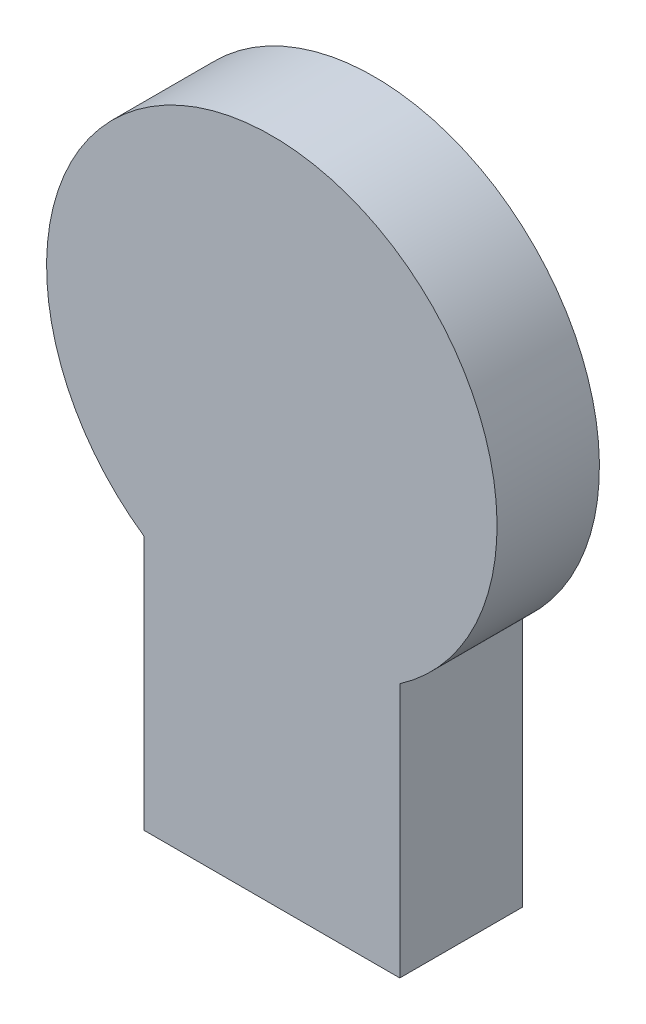
ISO-10303-21;
HEADER;
FILE_DESCRIPTION(('STEP AP214'),'2;1');
FILE_NAME('part.step','',(''),(''),'','','');
FILE_SCHEMA(('AUTOMOTIVE_DESIGN { 1 0 10303 214 1 1 1 1 }'));
ENDSEC;
DATA;
#1=APPLICATION_CONTEXT('core data for automotive mechanical design processes');
#2=APPLICATION_PROTOCOL_DEFINITION('international standard','automotive_design',2000,#1);
#3=PRODUCT_CONTEXT('',#1,'mechanical');
#4=PRODUCT('Part','Part','',(#3));
#5=PRODUCT_RELATED_PRODUCT_CATEGORY('part','',(#4));
#6=PRODUCT_DEFINITION_FORMATION('','',#4);
#7=PRODUCT_DEFINITION_CONTEXT('part definition',#1,'design');
#8=PRODUCT_DEFINITION('design','',#6,#7);
#9=PRODUCT_DEFINITION_SHAPE('','',#8);
#10=(LENGTH_UNIT() NAMED_UNIT(*) SI_UNIT(.MILLI.,.METRE.));
#11=(NAMED_UNIT(*) PLANE_ANGLE_UNIT() SI_UNIT($,.RADIAN.));
#12=(NAMED_UNIT(*) SI_UNIT($,.STERADIAN.) SOLID_ANGLE_UNIT());
#13=UNCERTAINTY_MEASURE_WITH_UNIT(LENGTH_MEASURE(1.E-05),#10,'distance_accuracy_value','');
#14=(GEOMETRIC_REPRESENTATION_CONTEXT(3) GLOBAL_UNCERTAINTY_ASSIGNED_CONTEXT((#13)) GLOBAL_UNIT_ASSIGNED_CONTEXT((#10,
#11,#12)) REPRESENTATION_CONTEXT('',''));
#15=CARTESIAN_POINT('',(0.,0.,0.));
#16=DIRECTION('',(0.,0.,1.));
#17=DIRECTION('',(1.,0.,0.));
#18=AXIS2_PLACEMENT_3D('',#15,#16,#17);
#19=CARTESIAN_POINT('',(0.,0.,20.));
#20=DIRECTION('',(0.,0.,-1.));
#21=DIRECTION('',(-1.,0.,0.));
#22=AXIS2_PLACEMENT_3D('',#19,#20,#21);
#23=CYLINDRICAL_SURFACE('',#22,44.);
#24=CARTESIAN_POINT('',(0.,0.,0.));
#25=DIRECTION('',(0.,0.,1.));
#26=DIRECTION('',(1.,0.,0.));
#27=AXIS2_PLACEMENT_3D('',#24,#25,#26);
#28=CIRCLE('',#27,44.);
#29=CARTESIAN_POINT('',(25.,-36.2077339804633,0.));
#30=VERTEX_POINT('',#29);
#31=CARTESIAN_POINT('',(-25.,-36.2077339804633,0.));
#32=VERTEX_POINT('',#31);
#33=EDGE_CURVE('E217',#30,#32,#28,.T.);
#34=ORIENTED_EDGE('',*,*,#33,.T.);
#35=DIRECTION('',(0.,0.,-1.));
#36=VECTOR('',#35,1.);
#37=CARTESIAN_POINT('',(-25.,-36.2077339804633,20.));
#38=LINE('',#37,#36);
#39=CARTESIAN_POINT('',(-25.,-36.2077339804633,20.));
#40=VERTEX_POINT('',#39);
#41=EDGE_CURVE('E11',#40,#32,#38,.T.);
#42=ORIENTED_EDGE('',*,*,#41,.F.);
#43=CARTESIAN_POINT('',(0.,0.,20.));
#44=DIRECTION('',(0.,0.,1.));
#45=DIRECTION('',(1.,0.,0.));
#46=AXIS2_PLACEMENT_3D('',#43,#44,#45);
#47=CIRCLE('',#46,44.);
#48=CARTESIAN_POINT('',(25.,-36.2077339804633,20.));
#49=VERTEX_POINT('',#48);
#50=EDGE_CURVE('E226',#49,#40,#47,.T.);
#51=ORIENTED_EDGE('',*,*,#50,.F.);
#52=DIRECTION('',(0.,0.,-1.));
#53=VECTOR('',#52,1.);
#54=CARTESIAN_POINT('',(25.,-36.2077339804633,20.));
#55=LINE('',#54,#53);
#56=EDGE_CURVE('E239',#49,#30,#55,.T.);
#57=ORIENTED_EDGE('',*,*,#56,.T.);
#58=EDGE_LOOP('',(#34,#42,#51,#57));
#59=FACE_BOUND('',#58,.T.);
#60=ADVANCED_FACE('F45',(#59),#23,.T.);
#61=CARTESIAN_POINT('',(-25.,0.,20.));
#62=DIRECTION('',(1.,0.,0.));
#63=DIRECTION('',(0.,0.,-1.));
#64=AXIS2_PLACEMENT_3D('',#61,#62,#63);
#65=PLANE('',#64);
#66=ORIENTED_EDGE('',*,*,#41,.T.);
#67=DIRECTION('',(0.,0.,1.));
#68=VECTOR('',#67,1.);
#69=CARTESIAN_POINT('',(-25.,-36.2077339804633,-4.));
#70=LINE('',#69,#68);
#71=CARTESIAN_POINT('',(-25.,-36.2077339804633,-4.));
#72=VERTEX_POINT('',#71);
#73=EDGE_CURVE('E178',#72,#32,#70,.T.);
#74=ORIENTED_EDGE('',*,*,#73,.F.);
#75=DIRECTION('',(0.,1.,0.));
#76=VECTOR('',#75,1.);
#77=CARTESIAN_POINT('',(-25.,0.,-4.));
#78=LINE('',#77,#76);
#79=CARTESIAN_POINT('',(-25.,-86.,-4.));
#80=VERTEX_POINT('',#79);
#81=EDGE_CURVE('E153',#80,#72,#78,.T.);
#82=ORIENTED_EDGE('',*,*,#81,.F.);
#83=DIRECTION('',(0.,0.,-1.));
#84=VECTOR('',#83,1.);
#85=CARTESIAN_POINT('',(-25.,-86.,20.));
#86=LINE('',#85,#84);
#87=CARTESIAN_POINT('',(-25.,-86.,20.));
#88=VERTEX_POINT('',#87);
#89=EDGE_CURVE('E53',#88,#80,#86,.T.);
#90=ORIENTED_EDGE('',*,*,#89,.F.);
#91=DIRECTION('',(0.,-1.,0.));
#92=VECTOR('',#91,1.);
#93=CARTESIAN_POINT('',(-25.,0.,20.));
#94=LINE('',#93,#92);
#95=EDGE_CURVE('E230',#40,#88,#94,.T.);
#96=ORIENTED_EDGE('',*,*,#95,.F.);
#97=EDGE_LOOP('',(#66,#74,#82,#90,#96));
#98=FACE_BOUND('',#97,.T.);
#99=ADVANCED_FACE('F258',(#98),#65,.F.);
#100=CARTESIAN_POINT('',(0.,-86.,20.));
#101=DIRECTION('',(0.,1.,0.));
#102=DIRECTION('',(0.,0.,1.));
#103=AXIS2_PLACEMENT_3D('',#100,#101,#102);
#104=PLANE('',#103);
#105=ORIENTED_EDGE('',*,*,#89,.T.);
#106=DIRECTION('',(-1.,0.,0.));
#107=VECTOR('',#106,1.);
#108=CARTESIAN_POINT('',(0.,-86.,-4.));
#109=LINE('',#108,#107);
#110=CARTESIAN_POINT('',(25.,-86.,-4.));
#111=VERTEX_POINT('',#110);
#112=EDGE_CURVE('E173',#111,#80,#109,.T.);
#113=ORIENTED_EDGE('',*,*,#112,.F.);
#114=DIRECTION('',(0.,0.,-1.));
#115=VECTOR('',#114,1.);
#116=CARTESIAN_POINT('',(25.,-86.,20.));
#117=LINE('',#116,#115);
#118=CARTESIAN_POINT('',(25.,-86.,20.));
#119=VERTEX_POINT('',#118);
#120=EDGE_CURVE('E246',#119,#111,#117,.T.);
#121=ORIENTED_EDGE('',*,*,#120,.F.);
#122=DIRECTION('',(1.,0.,0.));
#123=VECTOR('',#122,1.);
#124=CARTESIAN_POINT('',(0.,-86.,20.));
#125=LINE('',#124,#123);
#126=EDGE_CURVE('E233',#88,#119,#125,.T.);
#127=ORIENTED_EDGE('',*,*,#126,.F.);
#128=EDGE_LOOP('',(#105,#113,#121,#127));
#129=FACE_BOUND('',#128,.T.);
#130=ADVANCED_FACE('F253',(#129),#104,.F.);
#131=CARTESIAN_POINT('',(25.,0.,20.));
#132=DIRECTION('',(-1.,0.,0.));
#133=DIRECTION('',(0.,-1.,0.));
#134=AXIS2_PLACEMENT_3D('',#131,#132,#133);
#135=PLANE('',#134);
#136=ORIENTED_EDGE('',*,*,#120,.T.);
#137=DIRECTION('',(0.,-1.,0.));
#138=VECTOR('',#137,1.);
#139=CARTESIAN_POINT('',(25.,0.,-4.));
#140=LINE('',#139,#138);
#141=CARTESIAN_POINT('',(25.,-36.2077339804633,-4.));
#142=VERTEX_POINT('',#141);
#143=EDGE_CURVE('E169',#142,#111,#140,.T.);
#144=ORIENTED_EDGE('',*,*,#143,.F.);
#145=DIRECTION('',(0.,0.,1.));
#146=VECTOR('',#145,1.);
#147=CARTESIAN_POINT('',(25.,-36.2077339804633,-4.));
#148=LINE('',#147,#146);
#149=EDGE_CURVE('E183',#142,#30,#148,.T.);
#150=ORIENTED_EDGE('',*,*,#149,.T.);
#151=ORIENTED_EDGE('',*,*,#56,.F.);
#152=DIRECTION('',(0.,1.,0.));
#153=VECTOR('',#152,1.);
#154=CARTESIAN_POINT('',(25.,0.,20.));
#155=LINE('',#154,#153);
#156=EDGE_CURVE('E236',#119,#49,#155,.T.);
#157=ORIENTED_EDGE('',*,*,#156,.F.);
#158=EDGE_LOOP('',(#136,#144,#150,#151,#157));
#159=FACE_BOUND('',#158,.T.);
#160=ADVANCED_FACE('F280',(#159),#135,.F.);
#161=CARTESIAN_POINT('',(0.,0.,20.));
#162=DIRECTION('',(0.,0.,1.));
#163=DIRECTION('',(1.,0.,0.));
#164=AXIS2_PLACEMENT_3D('',#161,#162,#163);
#165=PLANE('',#164);
#166=ORIENTED_EDGE('',*,*,#50,.T.);
#167=ORIENTED_EDGE('',*,*,#95,.T.);
#168=ORIENTED_EDGE('',*,*,#126,.T.);
#169=ORIENTED_EDGE('',*,*,#156,.T.);
#170=EDGE_LOOP('',(#166,#167,#168,#169));
#171=FACE_BOUND('',#170,.T.);
#172=ADVANCED_FACE('F284',(#171),#165,.T.);
#173=CARTESIAN_POINT('',(0.,0.,0.));
#174=DIRECTION('',(0.,0.,1.));
#175=DIRECTION('',(1.,0.,0.));
#176=AXIS2_PLACEMENT_3D('',#173,#174,#175);
#177=PLANE('',#176);
#178=DIRECTION('',(0.,1.,0.));
#179=VECTOR('',#178,1.);
#180=CARTESIAN_POINT('',(-20.,-81.,0.));
#181=LINE('',#180,#179);
#182=CARTESIAN_POINT('',(-20.,-36.2077339804633,0.));
#183=VERTEX_POINT('',#182);
#184=CARTESIAN_POINT('',(-20.,-33.4813380855664,0.));
#185=VERTEX_POINT('',#184);
#186=EDGE_CURVE('E68',#183,#185,#181,.T.);
#187=ORIENTED_EDGE('',*,*,#186,.F.);
#188=DIRECTION('',(-1.,0.,0.));
#189=VECTOR('',#188,1.);
#190=CARTESIAN_POINT('',(0.,-36.2077339804633,0.));
#191=LINE('',#190,#189);
#192=EDGE_CURVE('E136',#183,#32,#191,.T.);
#193=ORIENTED_EDGE('',*,*,#192,.T.);
#194=ORIENTED_EDGE('',*,*,#33,.F.);
#195=DIRECTION('',(-1.,0.,0.));
#196=VECTOR('',#195,1.);
#197=CARTESIAN_POINT('',(0.,-36.2077339804634,0.));
#198=LINE('',#197,#196);
#199=CARTESIAN_POINT('',(20.,-36.2077339804633,0.));
#200=VERTEX_POINT('',#199);
#201=EDGE_CURVE('E156',#30,#200,#198,.T.);
#202=ORIENTED_EDGE('',*,*,#201,.T.);
#203=DIRECTION('',(0.,-1.,0.));
#204=VECTOR('',#203,1.);
#205=CARTESIAN_POINT('',(20.,-33.4813380855664,0.));
#206=LINE('',#205,#204);
#207=CARTESIAN_POINT('',(20.0000000000001,-33.4813380855664,0.));
#208=VERTEX_POINT('',#207);
#209=EDGE_CURVE('E193',#208,#200,#206,.T.);
#210=ORIENTED_EDGE('',*,*,#209,.F.);
#211=CARTESIAN_POINT('',(0.,0.,0.));
#212=DIRECTION('',(0.,0.,-1.));
#213=DIRECTION('',(-1.,0.,0.));
#214=AXIS2_PLACEMENT_3D('',#211,#212,#213);
#215=CIRCLE('',#214,39.);
#216=EDGE_CURVE('E208',#185,#208,#215,.T.);
#217=ORIENTED_EDGE('',*,*,#216,.F.);
#218=EDGE_LOOP('',(#187,#193,#194,#202,#210,#217));
#219=FACE_BOUND('',#218,.T.);
#220=ADVANCED_FACE('F262',(#219),#177,.F.);
#221=CARTESIAN_POINT('',(-20.,-81.,15.));
#222=DIRECTION('',(-1.,0.,0.));
#223=DIRECTION('',(0.,0.,1.));
#224=AXIS2_PLACEMENT_3D('',#221,#222,#223);
#225=PLANE('',#224);
#226=DIRECTION('',(0.,0.,-1.));
#227=VECTOR('',#226,1.);
#228=CARTESIAN_POINT('',(-20.,-81.,15.));
#229=LINE('',#228,#227);
#230=CARTESIAN_POINT('',(-20.,-81.,15.));
#231=VERTEX_POINT('',#230);
#232=CARTESIAN_POINT('',(-20.,-81.,-4.));
#233=VERTEX_POINT('',#232);
#234=EDGE_CURVE('E143',#231,#233,#229,.T.);
#235=ORIENTED_EDGE('',*,*,#234,.T.);
#236=DIRECTION('',(0.,-1.,0.));
#237=VECTOR('',#236,1.);
#238=CARTESIAN_POINT('',(-20.,0.,-4.));
#239=LINE('',#238,#237);
#240=CARTESIAN_POINT('',(-20.,-36.2077339804633,-4.));
#241=VERTEX_POINT('',#240);
#242=EDGE_CURVE('E140',#241,#233,#239,.T.);
#243=ORIENTED_EDGE('',*,*,#242,.F.);
#244=DIRECTION('',(0.,0.,1.));
#245=VECTOR('',#244,1.);
#246=CARTESIAN_POINT('',(-20.,-36.2077339804633,-4.));
#247=LINE('',#246,#245);
#248=EDGE_CURVE('E130',#241,#183,#247,.T.);
#249=ORIENTED_EDGE('',*,*,#248,.T.);
#250=ORIENTED_EDGE('',*,*,#186,.T.);
#251=DIRECTION('',(0.,0.,-1.));
#252=VECTOR('',#251,1.);
#253=CARTESIAN_POINT('',(-20.,-33.4813380855664,15.));
#254=LINE('',#253,#252);
#255=CARTESIAN_POINT('',(-20.,-33.4813380855664,15.));
#256=VERTEX_POINT('',#255);
#257=EDGE_CURVE('E205',#256,#185,#254,.T.);
#258=ORIENTED_EDGE('',*,*,#257,.F.);
#259=DIRECTION('',(0.,1.,0.));
#260=VECTOR('',#259,1.);
#261=CARTESIAN_POINT('',(-20.,-81.,15.));
#262=LINE('',#261,#260);
#263=EDGE_CURVE('E188',#231,#256,#262,.T.);
#264=ORIENTED_EDGE('',*,*,#263,.F.);
#265=EDGE_LOOP('',(#235,#243,#249,#250,#258,#264));
#266=FACE_BOUND('',#265,.T.);
#267=ADVANCED_FACE('F141',(#266),#225,.F.);
#268=CARTESIAN_POINT('',(20.,-81.,15.));
#269=DIRECTION('',(0.,-1.,0.));
#270=DIRECTION('',(0.,0.,-1.));
#271=AXIS2_PLACEMENT_3D('',#268,#269,#270);
#272=PLANE('',#271);
#273=DIRECTION('',(0.,0.,-1.));
#274=VECTOR('',#273,1.);
#275=CARTESIAN_POINT('',(20.,-81.,15.));
#276=LINE('',#275,#274);
#277=CARTESIAN_POINT('',(20.,-81.,15.));
#278=VERTEX_POINT('',#277);
#279=CARTESIAN_POINT('',(20.,-81.,-4.));
#280=VERTEX_POINT('',#279);
#281=EDGE_CURVE('E218',#278,#280,#276,.T.);
#282=ORIENTED_EDGE('',*,*,#281,.T.);
#283=DIRECTION('',(1.,0.,0.));
#284=VECTOR('',#283,1.);
#285=CARTESIAN_POINT('',(0.,-81.,-4.));
#286=LINE('',#285,#284);
#287=EDGE_CURVE('E148',#233,#280,#286,.T.);
#288=ORIENTED_EDGE('',*,*,#287,.F.);
#289=ORIENTED_EDGE('',*,*,#234,.F.);
#290=DIRECTION('',(-1.,0.,0.));
#291=VECTOR('',#290,1.);
#292=CARTESIAN_POINT('',(20.,-81.,15.));
#293=LINE('',#292,#291);
#294=EDGE_CURVE('E201',#278,#231,#293,.T.);
#295=ORIENTED_EDGE('',*,*,#294,.F.);
#296=EDGE_LOOP('',(#282,#288,#289,#295));
#297=FACE_BOUND('',#296,.T.);
#298=ADVANCED_FACE('F273',(#297),#272,.F.);
#299=CARTESIAN_POINT('',(20.,-33.4813380855664,15.));
#300=DIRECTION('',(1.,0.,0.));
#301=DIRECTION('',(0.,0.,-1.));
#302=AXIS2_PLACEMENT_3D('',#299,#300,#301);
#303=PLANE('',#302);
#304=ORIENTED_EDGE('',*,*,#209,.T.);
#305=DIRECTION('',(0.,0.,1.));
#306=VECTOR('',#305,1.);
#307=CARTESIAN_POINT('',(20.,-36.2077339804633,-4.));
#308=LINE('',#307,#306);
#309=CARTESIAN_POINT('',(20.,-36.2077339804633,-4.));
#310=VERTEX_POINT('',#309);
#311=EDGE_CURVE('E60',#310,#200,#308,.T.);
#312=ORIENTED_EDGE('',*,*,#311,.F.);
#313=DIRECTION('',(0.,1.,0.));
#314=VECTOR('',#313,1.);
#315=CARTESIAN_POINT('',(20.,0.,-4.));
#316=LINE('',#315,#314);
#317=EDGE_CURVE('E163',#280,#310,#316,.T.);
#318=ORIENTED_EDGE('',*,*,#317,.F.);
#319=ORIENTED_EDGE('',*,*,#281,.F.);
#320=DIRECTION('',(0.,-1.,0.));
#321=VECTOR('',#320,1.);
#322=CARTESIAN_POINT('',(20.,-33.4813380855664,15.));
#323=LINE('',#322,#321);
#324=CARTESIAN_POINT('',(20.0000000000001,-33.4813380855664,15.));
#325=VERTEX_POINT('',#324);
#326=EDGE_CURVE('E197',#325,#278,#323,.T.);
#327=ORIENTED_EDGE('',*,*,#326,.F.);
#328=DIRECTION('',(0.,0.,-1.));
#329=VECTOR('',#328,1.);
#330=CARTESIAN_POINT('',(20.0000000000001,-33.4813380855664,15.));
#331=LINE('',#330,#329);
#332=EDGE_CURVE('E221',#325,#208,#331,.T.);
#333=ORIENTED_EDGE('',*,*,#332,.T.);
#334=EDGE_LOOP('',(#304,#312,#318,#319,#327,#333));
#335=FACE_BOUND('',#334,.T.);
#336=ADVANCED_FACE('F276',(#335),#303,.F.);
#337=CARTESIAN_POINT('',(0.,0.,15.));
#338=DIRECTION('',(0.,0.,-1.));
#339=DIRECTION('',(-1.,0.,0.));
#340=AXIS2_PLACEMENT_3D('',#337,#338,#339);
#341=CYLINDRICAL_SURFACE('',#340,39.);
#342=ORIENTED_EDGE('',*,*,#216,.T.);
#343=ORIENTED_EDGE('',*,*,#332,.F.);
#344=CARTESIAN_POINT('',(0.,0.,15.));
#345=DIRECTION('',(0.,0.,-1.));
#346=DIRECTION('',(-1.,0.,0.));
#347=AXIS2_PLACEMENT_3D('',#344,#345,#346);
#348=CIRCLE('',#347,39.);
#349=EDGE_CURVE('E192',#256,#325,#348,.T.);
#350=ORIENTED_EDGE('',*,*,#349,.F.);
#351=ORIENTED_EDGE('',*,*,#257,.T.);
#352=EDGE_LOOP('',(#342,#343,#350,#351));
#353=FACE_BOUND('',#352,.T.);
#354=ADVANCED_FACE('F266',(#353),#341,.F.);
#355=CARTESIAN_POINT('',(0.,0.,15.));
#356=DIRECTION('',(0.,0.,-1.));
#357=DIRECTION('',(-1.,0.,0.));
#358=AXIS2_PLACEMENT_3D('',#355,#356,#357);
#359=PLANE('',#358);
#360=ORIENTED_EDGE('',*,*,#263,.T.);
#361=ORIENTED_EDGE('',*,*,#349,.T.);
#362=ORIENTED_EDGE('',*,*,#326,.T.);
#363=ORIENTED_EDGE('',*,*,#294,.T.);
#364=EDGE_LOOP('',(#360,#361,#362,#363));
#365=FACE_BOUND('',#364,.T.);
#366=ADVANCED_FACE('F271',(#365),#359,.T.);
#367=CARTESIAN_POINT('',(0.,-36.2077339804633,-4.));
#368=DIRECTION('',(0.,1.,0.));
#369=DIRECTION('',(-1.,0.,0.));
#370=AXIS2_PLACEMENT_3D('',#367,#368,#369);
#371=PLANE('',#370);
#372=ORIENTED_EDGE('',*,*,#192,.F.);
#373=ORIENTED_EDGE('',*,*,#248,.F.);
#374=DIRECTION('',(-1.,0.,0.));
#375=VECTOR('',#374,1.);
#376=CARTESIAN_POINT('',(0.,-36.2077339804633,-4.));
#377=LINE('',#376,#375);
#378=EDGE_CURVE('E134',#241,#72,#377,.T.);
#379=ORIENTED_EDGE('',*,*,#378,.T.);
#380=ORIENTED_EDGE('',*,*,#73,.T.);
#381=EDGE_LOOP('',(#372,#373,#379,#380));
#382=FACE_BOUND('',#381,.T.);
#383=ADVANCED_FACE('F132',(#382),#371,.T.);
#384=CARTESIAN_POINT('',(0.,-36.2077339804634,-4.));
#385=DIRECTION('',(0.,1.,0.));
#386=DIRECTION('',(-1.,0.,0.));
#387=AXIS2_PLACEMENT_3D('',#384,#385,#386);
#388=PLANE('',#387);
#389=ORIENTED_EDGE('',*,*,#201,.F.);
#390=ORIENTED_EDGE('',*,*,#149,.F.);
#391=DIRECTION('',(-1.,0.,0.));
#392=VECTOR('',#391,1.);
#393=CARTESIAN_POINT('',(0.,-36.2077339804634,-4.));
#394=LINE('',#393,#392);
#395=EDGE_CURVE('E166',#142,#310,#394,.T.);
#396=ORIENTED_EDGE('',*,*,#395,.T.);
#397=ORIENTED_EDGE('',*,*,#311,.T.);
#398=EDGE_LOOP('',(#389,#390,#396,#397));
#399=FACE_BOUND('',#398,.T.);
#400=ADVANCED_FACE('F277',(#399),#388,.T.);
#401=CARTESIAN_POINT('',(0.,0.,-4.));
#402=DIRECTION('',(0.,0.,-1.));
#403=DIRECTION('',(-1.,0.,0.));
#404=AXIS2_PLACEMENT_3D('',#401,#402,#403);
#405=PLANE('',#404);
#406=ORIENTED_EDGE('',*,*,#378,.F.);
#407=ORIENTED_EDGE('',*,*,#242,.T.);
#408=ORIENTED_EDGE('',*,*,#287,.T.);
#409=ORIENTED_EDGE('',*,*,#317,.T.);
#410=ORIENTED_EDGE('',*,*,#395,.F.);
#411=ORIENTED_EDGE('',*,*,#143,.T.);
#412=ORIENTED_EDGE('',*,*,#112,.T.);
#413=ORIENTED_EDGE('',*,*,#81,.T.);
#414=EDGE_LOOP('',(#406,#407,#408,#409,#410,#411,#412,#413));
#415=FACE_BOUND('',#414,.T.);
#416=ADVANCED_FACE('F150',(#415),#405,.T.);
#417=CLOSED_SHELL('',(#60,#99,#130,#160,#172,#220,#267,#298,#336,#354,#366,#383,#400,#416));
#418=MANIFOLD_SOLID_BREP('B2',#417);
#419=ADVANCED_BREP_SHAPE_REPRESENTATION('',(#18,#418),#14);
#420=SHAPE_DEFINITION_REPRESENTATION(#9,#419);
ENDSEC;
END-ISO-10303-21;
